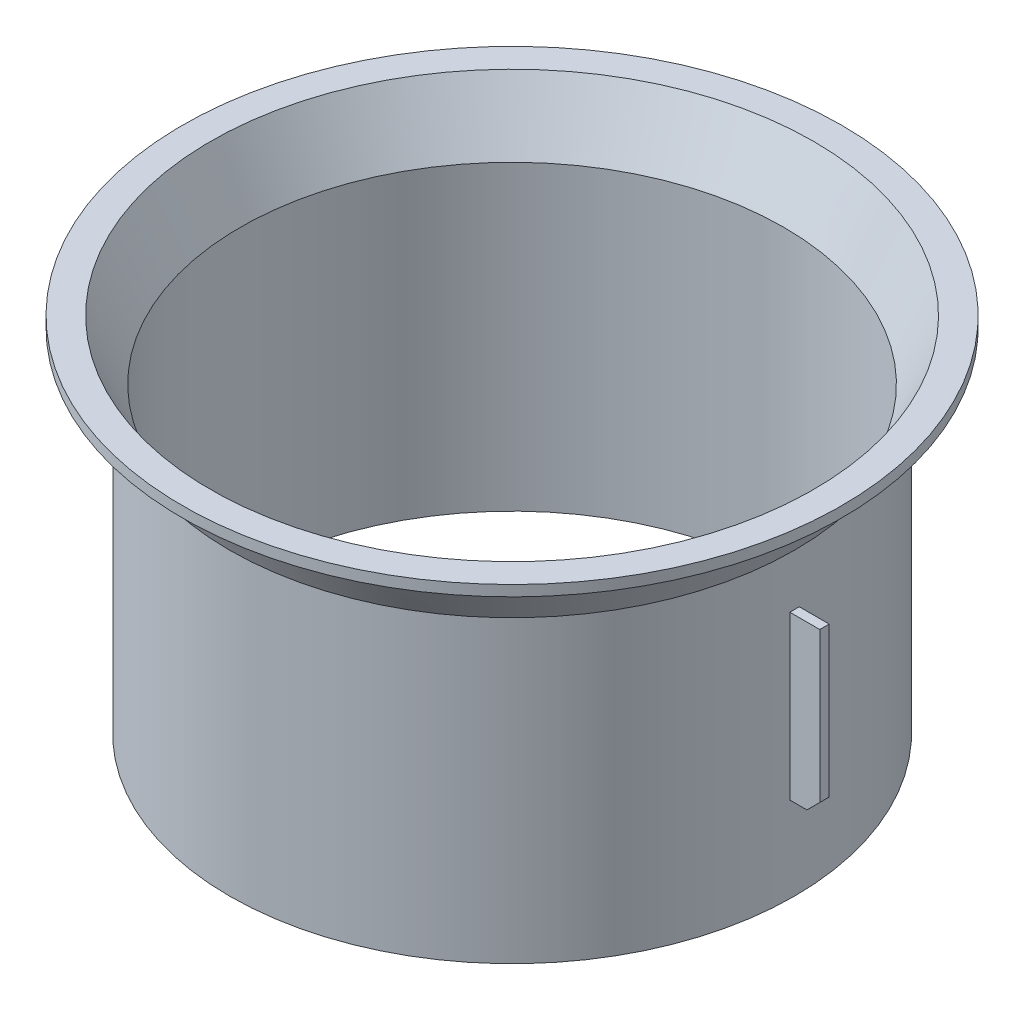
ISO-10303-21;
HEADER;
FILE_DESCRIPTION(('STEP AP214'),'2;1');
FILE_NAME('part.step','',(''),(''),'','','');
FILE_SCHEMA(('AUTOMOTIVE_DESIGN { 1 0 10303 214 1 1 1 1 }'));
ENDSEC;
DATA;
#1=APPLICATION_CONTEXT('core data for automotive mechanical design processes');
#2=APPLICATION_PROTOCOL_DEFINITION('international standard','automotive_design',2000,#1);
#3=PRODUCT_CONTEXT('',#1,'mechanical');
#4=PRODUCT('Part','Part','',(#3));
#5=PRODUCT_RELATED_PRODUCT_CATEGORY('part','',(#4));
#6=PRODUCT_DEFINITION_FORMATION('','',#4);
#7=PRODUCT_DEFINITION_CONTEXT('part definition',#1,'design');
#8=PRODUCT_DEFINITION('design','',#6,#7);
#9=PRODUCT_DEFINITION_SHAPE('','',#8);
#10=(LENGTH_UNIT() NAMED_UNIT(*) SI_UNIT(.MILLI.,.METRE.));
#11=(NAMED_UNIT(*) PLANE_ANGLE_UNIT() SI_UNIT($,.RADIAN.));
#12=(NAMED_UNIT(*) SI_UNIT($,.STERADIAN.) SOLID_ANGLE_UNIT());
#13=UNCERTAINTY_MEASURE_WITH_UNIT(LENGTH_MEASURE(1.E-05),#10,'distance_accuracy_value','');
#14=(GEOMETRIC_REPRESENTATION_CONTEXT(3) GLOBAL_UNCERTAINTY_ASSIGNED_CONTEXT((#13)) GLOBAL_UNIT_ASSIGNED_CONTEXT((#10,
#11,#12)) REPRESENTATION_CONTEXT('',''));
#15=CARTESIAN_POINT('',(0.,0.,0.));
#16=DIRECTION('',(0.,0.,1.));
#17=DIRECTION('',(1.,0.,0.));
#18=AXIS2_PLACEMENT_3D('',#15,#16,#17);
#19=CARTESIAN_POINT('',(0.,0.,0.));
#20=DIRECTION('',(0.,-1.,0.));
#21=DIRECTION('',(0.,0.,-1.));
#22=AXIS2_PLACEMENT_3D('',#19,#20,#21);
#23=CYLINDRICAL_SURFACE('',#22,33.);
#24=CARTESIAN_POINT('',(0.,35.,0.));
#25=DIRECTION('',(0.,-1.,0.));
#26=DIRECTION('',(0.,0.,-1.));
#27=AXIS2_PLACEMENT_3D('',#24,#25,#26);
#28=CIRCLE('',#27,33.);
#29=CARTESIAN_POINT('',(0.,35.,-33.));
#30=VERTEX_POINT('',#29);
#31=EDGE_CURVE('E198',#30,#30,#28,.T.);
#32=ORIENTED_EDGE('',*,*,#31,.T.);
#33=EDGE_LOOP('',(#32));
#34=FACE_BOUND('',#33,.T.);
#35=CARTESIAN_POINT('',(0.,0.,0.));
#36=DIRECTION('',(0.,-1.,0.));
#37=DIRECTION('',(0.,0.,-1.));
#38=AXIS2_PLACEMENT_3D('',#35,#36,#37);
#39=CIRCLE('',#38,33.);
#40=CARTESIAN_POINT('',(0.,0.,-33.));
#41=VERTEX_POINT('',#40);
#42=EDGE_CURVE('E201',#41,#41,#39,.T.);
#43=ORIENTED_EDGE('',*,*,#42,.F.);
#44=EDGE_LOOP('',(#43));
#45=FACE_BOUND('',#44,.T.);
#46=DIRECTION('',(0.,-1.,0.));
#47=VECTOR('',#46,1.);
#48=CARTESIAN_POINT('',(-32.9954163483354,29.,-0.550000000000006));
#49=LINE('',#48,#47);
#50=CARTESIAN_POINT('',(-32.9954163483354,29.,-0.550000000000006));
#51=VERTEX_POINT('',#50);
#52=CARTESIAN_POINT('',(-32.9954163483354,10.,-0.550000000000012));
#53=VERTEX_POINT('',#52);
#54=EDGE_CURVE('E172',#51,#53,#49,.T.);
#55=ORIENTED_EDGE('',*,*,#54,.F.);
#56=CARTESIAN_POINT('',(0.,29.,0.));
#57=DIRECTION('',(0.,-1.,0.));
#58=DIRECTION('',(0.,0.,-1.));
#59=AXIS2_PLACEMENT_3D('',#56,#57,#58);
#60=CIRCLE('',#59,33.);
#61=CARTESIAN_POINT('',(-32.9954163483354,29.,0.549999999999994));
#62=VERTEX_POINT('',#61);
#63=EDGE_CURVE('E207',#51,#62,#60,.F.);
#64=ORIENTED_EDGE('',*,*,#63,.T.);
#65=DIRECTION('',(0.,-1.,0.));
#66=VECTOR('',#65,1.);
#67=CARTESIAN_POINT('',(-32.9954163483354,29.,0.549999999999994));
#68=LINE('',#67,#66);
#69=CARTESIAN_POINT('',(-32.9954163483354,10.,0.549999999999994));
#70=VERTEX_POINT('',#69);
#71=EDGE_CURVE('E168',#62,#70,#68,.T.);
#72=ORIENTED_EDGE('',*,*,#71,.T.);
#73=CARTESIAN_POINT('',(0.,10.,0.));
#74=DIRECTION('',(0.,-1.,0.));
#75=DIRECTION('',(0.,0.,-1.));
#76=AXIS2_PLACEMENT_3D('',#73,#74,#75);
#77=CIRCLE('',#76,33.);
#78=EDGE_CURVE('E204',#53,#70,#77,.F.);
#79=ORIENTED_EDGE('',*,*,#78,.F.);
#80=EDGE_LOOP('',(#55,#64,#72,#79));
#81=FACE_BOUND('',#80,.T.);
#82=DIRECTION('',(0.,-1.,0.));
#83=VECTOR('',#82,1.);
#84=CARTESIAN_POINT('',(32.9954163483354,29.,0.549999999999994));
#85=LINE('',#84,#83);
#86=CARTESIAN_POINT('',(32.9954163483354,29.,0.549999999999994));
#87=VERTEX_POINT('',#86);
#88=CARTESIAN_POINT('',(32.9954163483354,10.,0.549999999999995));
#89=VERTEX_POINT('',#88);
#90=EDGE_CURVE('E152',#87,#89,#85,.T.);
#91=ORIENTED_EDGE('',*,*,#90,.F.);
#92=CARTESIAN_POINT('',(0.,29.,0.));
#93=DIRECTION('',(0.,-1.,0.));
#94=DIRECTION('',(0.,0.,-1.));
#95=AXIS2_PLACEMENT_3D('',#92,#93,#94);
#96=CIRCLE('',#95,33.);
#97=CARTESIAN_POINT('',(32.9954163483354,29.,-0.550000000000006));
#98=VERTEX_POINT('',#97);
#99=EDGE_CURVE('E212',#87,#98,#96,.F.);
#100=ORIENTED_EDGE('',*,*,#99,.T.);
#101=DIRECTION('',(0.,-1.,0.));
#102=VECTOR('',#101,1.);
#103=CARTESIAN_POINT('',(32.9954163483354,29.,-0.550000000000006));
#104=LINE('',#103,#102);
#105=CARTESIAN_POINT('',(32.9954163483354,10.,-0.550000000000006));
#106=VERTEX_POINT('',#105);
#107=EDGE_CURVE('E130',#98,#106,#104,.T.);
#108=ORIENTED_EDGE('',*,*,#107,.T.);
#109=CARTESIAN_POINT('',(0.,10.,0.));
#110=DIRECTION('',(0.,-1.,0.));
#111=DIRECTION('',(0.,0.,-1.));
#112=AXIS2_PLACEMENT_3D('',#109,#110,#111);
#113=CIRCLE('',#112,33.);
#114=EDGE_CURVE('E209',#89,#106,#113,.F.);
#115=ORIENTED_EDGE('',*,*,#114,.F.);
#116=EDGE_LOOP('',(#91,#100,#108,#115));
#117=FACE_BOUND('',#116,.T.);
#118=ADVANCED_FACE('F44',(#34,#45,#81,#117),#23,.T.);
#119=CARTESIAN_POINT('',(31.75,0.,0.));
#120=DIRECTION('',(0.,-1.,0.));
#121=DIRECTION('',(0.,0.,-1.));
#122=AXIS2_PLACEMENT_3D('',#119,#120,#121);
#123=PLANE('',#122);
#124=ORIENTED_EDGE('',*,*,#42,.T.);
#125=EDGE_LOOP('',(#124));
#126=FACE_BOUND('',#125,.T.);
#127=CARTESIAN_POINT('',(0.,0.,0.));
#128=DIRECTION('',(0.,-1.,0.));
#129=DIRECTION('',(0.,0.,-1.));
#130=AXIS2_PLACEMENT_3D('',#127,#128,#129);
#131=CIRCLE('',#130,31.75);
#132=CARTESIAN_POINT('',(0.,0.,-31.75));
#133=VERTEX_POINT('',#132);
#134=EDGE_CURVE('E175',#133,#133,#131,.T.);
#135=ORIENTED_EDGE('',*,*,#134,.F.);
#136=EDGE_LOOP('',(#135));
#137=FACE_BOUND('',#136,.T.);
#138=ADVANCED_FACE('F252',(#126,#137),#123,.T.);
#139=CARTESIAN_POINT('',(0.,35.,0.));
#140=DIRECTION('',(0.,1.,0.));
#141=DIRECTION('',(0.,0.,1.));
#142=AXIS2_PLACEMENT_3D('',#139,#140,#141);
#143=CONICAL_SURFACE('',#142,33.,0.463647609000805);
#144=CARTESIAN_POINT('',(0.,41.,0.));
#145=DIRECTION('',(0.,-1.,0.));
#146=DIRECTION('',(0.,0.,-1.));
#147=AXIS2_PLACEMENT_3D('',#144,#145,#146);
#148=CIRCLE('',#147,36.);
#149=CARTESIAN_POINT('',(0.,41.,-36.));
#150=VERTEX_POINT('',#149);
#151=EDGE_CURVE('E195',#150,#150,#148,.T.);
#152=ORIENTED_EDGE('',*,*,#151,.T.);
#153=EDGE_LOOP('',(#152));
#154=FACE_BOUND('',#153,.T.);
#155=ORIENTED_EDGE('',*,*,#31,.F.);
#156=EDGE_LOOP('',(#155));
#157=FACE_BOUND('',#156,.T.);
#158=ADVANCED_FACE('F258',(#154,#157),#143,.T.);
#159=CARTESIAN_POINT('',(36.,41.,0.));
#160=DIRECTION('',(0.,-1.,0.));
#161=DIRECTION('',(0.,0.,-1.));
#162=AXIS2_PLACEMENT_3D('',#159,#160,#161);
#163=PLANE('',#162);
#164=CARTESIAN_POINT('',(0.,41.,0.));
#165=DIRECTION('',(0.,-1.,0.));
#166=DIRECTION('',(0.,0.,-1.));
#167=AXIS2_PLACEMENT_3D('',#164,#165,#166);
#168=CIRCLE('',#167,38.5);
#169=CARTESIAN_POINT('',(0.,41.,-38.5));
#170=VERTEX_POINT('',#169);
#171=EDGE_CURVE('E192',#170,#170,#168,.T.);
#172=ORIENTED_EDGE('',*,*,#171,.T.);
#173=EDGE_LOOP('',(#172));
#174=FACE_BOUND('',#173,.T.);
#175=ORIENTED_EDGE('',*,*,#151,.F.);
#176=EDGE_LOOP('',(#175));
#177=FACE_BOUND('',#176,.T.);
#178=ADVANCED_FACE('F265',(#174,#177),#163,.T.);
#179=CARTESIAN_POINT('',(0.,0.,0.));
#180=DIRECTION('',(0.,-1.,0.));
#181=DIRECTION('',(0.,0.,-1.));
#182=AXIS2_PLACEMENT_3D('',#179,#180,#181);
#183=CYLINDRICAL_SURFACE('',#182,38.5);
#184=CARTESIAN_POINT('',(0.,42.25,0.));
#185=DIRECTION('',(0.,-1.,0.));
#186=DIRECTION('',(0.,0.,-1.));
#187=AXIS2_PLACEMENT_3D('',#184,#185,#186);
#188=CIRCLE('',#187,38.5);
#189=CARTESIAN_POINT('',(0.,42.25,-38.5));
#190=VERTEX_POINT('',#189);
#191=EDGE_CURVE('E189',#190,#190,#188,.T.);
#192=ORIENTED_EDGE('',*,*,#191,.T.);
#193=EDGE_LOOP('',(#192));
#194=FACE_BOUND('',#193,.T.);
#195=ORIENTED_EDGE('',*,*,#171,.F.);
#196=EDGE_LOOP('',(#195));
#197=FACE_BOUND('',#196,.T.);
#198=ADVANCED_FACE('F269',(#194,#197),#183,.T.);
#199=CARTESIAN_POINT('',(38.5,42.25,0.));
#200=DIRECTION('',(0.,1.,0.));
#201=DIRECTION('',(0.,0.,1.));
#202=AXIS2_PLACEMENT_3D('',#199,#200,#201);
#203=PLANE('',#202);
#204=CARTESIAN_POINT('',(0.,42.25,0.));
#205=DIRECTION('',(0.,-1.,0.));
#206=DIRECTION('',(0.,0.,-1.));
#207=AXIS2_PLACEMENT_3D('',#204,#205,#206);
#208=CIRCLE('',#207,35.2274575140626);
#209=CARTESIAN_POINT('',(0.,42.25,-35.2274575140626));
#210=VERTEX_POINT('',#209);
#211=EDGE_CURVE('E186',#210,#210,#208,.T.);
#212=ORIENTED_EDGE('',*,*,#211,.T.);
#213=EDGE_LOOP('',(#212));
#214=FACE_BOUND('',#213,.T.);
#215=ORIENTED_EDGE('',*,*,#191,.F.);
#216=EDGE_LOOP('',(#215));
#217=FACE_BOUND('',#216,.T.);
#218=ADVANCED_FACE('F273',(#214,#217),#203,.T.);
#219=CARTESIAN_POINT('',(0.,42.25,0.));
#220=DIRECTION('',(0.,1.,0.));
#221=DIRECTION('',(0.,0.,1.));
#222=AXIS2_PLACEMENT_3D('',#219,#220,#221);
#223=CONICAL_SURFACE('',#222,35.2274575140626,0.463647609000805);
#224=CARTESIAN_POINT('',(0.,35.2950849718747,0.));
#225=DIRECTION('',(0.,-1.,0.));
#226=DIRECTION('',(0.,0.,-1.));
#227=AXIS2_PLACEMENT_3D('',#224,#225,#226);
#228=CIRCLE('',#227,31.75);
#229=CARTESIAN_POINT('',(0.,35.2950849718747,-31.75));
#230=VERTEX_POINT('',#229);
#231=EDGE_CURVE('E183',#230,#230,#228,.T.);
#232=ORIENTED_EDGE('',*,*,#231,.T.);
#233=EDGE_LOOP('',(#232));
#234=FACE_BOUND('',#233,.T.);
#235=ORIENTED_EDGE('',*,*,#211,.F.);
#236=EDGE_LOOP('',(#235));
#237=FACE_BOUND('',#236,.T.);
#238=ADVANCED_FACE('F277',(#234,#237),#223,.F.);
#239=CARTESIAN_POINT('',(0.,0.,0.));
#240=DIRECTION('',(0.,-1.,0.));
#241=DIRECTION('',(0.,0.,-1.));
#242=AXIS2_PLACEMENT_3D('',#239,#240,#241);
#243=CYLINDRICAL_SURFACE('',#242,31.75);
#244=ORIENTED_EDGE('',*,*,#134,.T.);
#245=EDGE_LOOP('',(#244));
#246=FACE_BOUND('',#245,.T.);
#247=ORIENTED_EDGE('',*,*,#231,.F.);
#248=EDGE_LOOP('',(#247));
#249=FACE_BOUND('',#248,.T.);
#250=ADVANCED_FACE('F281',(#246,#249),#243,.F.);
#251=CARTESIAN_POINT('',(-32.9954163483354,29.,-0.550000000000006));
#252=DIRECTION('',(0.,0.,-1.));
#253=DIRECTION('',(-1.,0.,0.));
#254=AXIS2_PLACEMENT_3D('',#251,#252,#253);
#255=PLANE('',#254);
#256=DIRECTION('',(1.,0.,0.));
#257=VECTOR('',#256,1.);
#258=CARTESIAN_POINT('',(-32.9954163483354,10.,-0.550000000000006));
#259=LINE('',#258,#257);
#260=CARTESIAN_POINT('',(-34.9954163483354,10.,-0.550000000000005));
#261=VERTEX_POINT('',#260);
#262=EDGE_CURVE('E162',#261,#53,#259,.T.);
#263=ORIENTED_EDGE('',*,*,#262,.F.);
#264=DIRECTION('',(0.707106781186544,-0.707106781186551,0.));
#265=VECTOR('',#264,1.);
#266=CARTESIAN_POINT('',(-43.4954163483354,18.5000000000001,-0.550000000000002));
#267=LINE('',#266,#265);
#268=CARTESIAN_POINT('',(-36.4954163483354,11.5,-0.550000000000005));
#269=VERTEX_POINT('',#268);
#270=EDGE_CURVE('E66',#261,#269,#267,.F.);
#271=ORIENTED_EDGE('',*,*,#270,.T.);
#272=DIRECTION('',(0.,-1.,0.));
#273=VECTOR('',#272,1.);
#274=CARTESIAN_POINT('',(-36.4954163483354,29.,-0.550000000000005));
#275=LINE('',#274,#273);
#276=CARTESIAN_POINT('',(-36.4954163483354,29.,-0.550000000000005));
#277=VERTEX_POINT('',#276);
#278=EDGE_CURVE('E176',#277,#269,#275,.T.);
#279=ORIENTED_EDGE('',*,*,#278,.F.);
#280=DIRECTION('',(1.,0.,0.));
#281=VECTOR('',#280,1.);
#282=CARTESIAN_POINT('',(-32.9954163483354,29.,-0.550000000000006));
#283=LINE('',#282,#281);
#284=EDGE_CURVE('E165',#277,#51,#283,.T.);
#285=ORIENTED_EDGE('',*,*,#284,.T.);
#286=ORIENTED_EDGE('',*,*,#54,.T.);
#287=EDGE_LOOP('',(#263,#271,#279,#285,#286));
#288=FACE_BOUND('',#287,.T.);
#289=ADVANCED_FACE('F232',(#288),#255,.T.);
#290=CARTESIAN_POINT('',(-36.4954163483354,29.,-0.550000000000005));
#291=DIRECTION('',(-1.,0.,0.));
#292=DIRECTION('',(0.,0.,1.));
#293=AXIS2_PLACEMENT_3D('',#290,#291,#292);
#294=PLANE('',#293);
#295=ORIENTED_EDGE('',*,*,#278,.T.);
#296=DIRECTION('',(0.,0.,1.));
#297=VECTOR('',#296,1.);
#298=CARTESIAN_POINT('',(-36.4954163483354,11.5,-0.550000000000005));
#299=LINE('',#298,#297);
#300=CARTESIAN_POINT('',(-36.4954163483354,11.5,0.549999999999995));
#301=VERTEX_POINT('',#300);
#302=EDGE_CURVE('E52',#269,#301,#299,.T.);
#303=ORIENTED_EDGE('',*,*,#302,.T.);
#304=DIRECTION('',(0.,-1.,0.));
#305=VECTOR('',#304,1.);
#306=CARTESIAN_POINT('',(-36.4954163483354,29.,0.549999999999995));
#307=LINE('',#306,#305);
#308=CARTESIAN_POINT('',(-36.4954163483354,29.,0.549999999999995));
#309=VERTEX_POINT('',#308);
#310=EDGE_CURVE('E178',#309,#301,#307,.T.);
#311=ORIENTED_EDGE('',*,*,#310,.F.);
#312=DIRECTION('',(0.,0.,-1.));
#313=VECTOR('',#312,1.);
#314=CARTESIAN_POINT('',(-36.4954163483354,29.,-0.550000000000005));
#315=LINE('',#314,#313);
#316=EDGE_CURVE('E161',#309,#277,#315,.T.);
#317=ORIENTED_EDGE('',*,*,#316,.T.);
#318=EDGE_LOOP('',(#295,#303,#311,#317));
#319=FACE_BOUND('',#318,.T.);
#320=ADVANCED_FACE('F288',(#319),#294,.T.);
#321=CARTESIAN_POINT('',(-32.9954163483354,29.,0.549999999999994));
#322=DIRECTION('',(0.,0.,1.));
#323=DIRECTION('',(1.,0.,0.));
#324=AXIS2_PLACEMENT_3D('',#321,#322,#323);
#325=PLANE('',#324);
#326=ORIENTED_EDGE('',*,*,#310,.T.);
#327=DIRECTION('',(-0.707106781186544,0.707106781186551,0.));
#328=VECTOR('',#327,1.);
#329=CARTESIAN_POINT('',(-43.4954163483354,18.5000000000001,0.549999999999998));
#330=LINE('',#329,#328);
#331=CARTESIAN_POINT('',(-34.9954163483354,10.,0.549999999999995));
#332=VERTEX_POINT('',#331);
#333=EDGE_CURVE('E13',#301,#332,#330,.F.);
#334=ORIENTED_EDGE('',*,*,#333,.T.);
#335=DIRECTION('',(-1.,0.,0.));
#336=VECTOR('',#335,1.);
#337=CARTESIAN_POINT('',(-32.9954163483354,10.,0.549999999999994));
#338=LINE('',#337,#336);
#339=EDGE_CURVE('E155',#70,#332,#338,.T.);
#340=ORIENTED_EDGE('',*,*,#339,.F.);
#341=ORIENTED_EDGE('',*,*,#71,.F.);
#342=DIRECTION('',(-1.,0.,0.));
#343=VECTOR('',#342,1.);
#344=CARTESIAN_POINT('',(-32.9954163483354,29.,0.549999999999994));
#345=LINE('',#344,#343);
#346=EDGE_CURVE('E158',#62,#309,#345,.T.);
#347=ORIENTED_EDGE('',*,*,#346,.T.);
#348=EDGE_LOOP('',(#326,#334,#340,#341,#347));
#349=FACE_BOUND('',#348,.T.);
#350=ADVANCED_FACE('F243',(#349),#325,.T.);
#351=CARTESIAN_POINT('',(0.,29.,0.));
#352=DIRECTION('',(0.,-1.,0.));
#353=DIRECTION('',(0.,0.,-1.));
#354=AXIS2_PLACEMENT_3D('',#351,#352,#353);
#355=PLANE('',#354);
#356=ORIENTED_EDGE('',*,*,#63,.F.);
#357=ORIENTED_EDGE('',*,*,#284,.F.);
#358=ORIENTED_EDGE('',*,*,#316,.F.);
#359=ORIENTED_EDGE('',*,*,#346,.F.);
#360=EDGE_LOOP('',(#356,#357,#358,#359));
#361=FACE_BOUND('',#360,.T.);
#362=ADVANCED_FACE('F240',(#361),#355,.F.);
#363=CARTESIAN_POINT('',(0.,10.,0.));
#364=DIRECTION('',(0.,-1.,0.));
#365=DIRECTION('',(0.,0.,-1.));
#366=AXIS2_PLACEMENT_3D('',#363,#364,#365);
#367=PLANE('',#366);
#368=ORIENTED_EDGE('',*,*,#339,.T.);
#369=DIRECTION('',(0.,0.,-1.));
#370=VECTOR('',#369,1.);
#371=CARTESIAN_POINT('',(-34.9954163483354,10.,0.));
#372=LINE('',#371,#370);
#373=EDGE_CURVE('E222',#332,#261,#372,.T.);
#374=ORIENTED_EDGE('',*,*,#373,.T.);
#375=ORIENTED_EDGE('',*,*,#262,.T.);
#376=ORIENTED_EDGE('',*,*,#78,.T.);
#377=EDGE_LOOP('',(#368,#374,#375,#376));
#378=FACE_BOUND('',#377,.T.);
#379=ADVANCED_FACE('F227',(#378),#367,.T.);
#380=CARTESIAN_POINT('',(32.9954163483354,29.,0.549999999999994));
#381=DIRECTION('',(0.,0.,1.));
#382=DIRECTION('',(1.,0.,0.));
#383=AXIS2_PLACEMENT_3D('',#380,#381,#382);
#384=PLANE('',#383);
#385=DIRECTION('',(-1.,0.,0.));
#386=VECTOR('',#385,1.);
#387=CARTESIAN_POINT('',(32.9954163483354,10.,0.549999999999994));
#388=LINE('',#387,#386);
#389=CARTESIAN_POINT('',(34.9954163483354,10.,0.549999999999995));
#390=VERTEX_POINT('',#389);
#391=EDGE_CURVE('E144',#390,#89,#388,.T.);
#392=ORIENTED_EDGE('',*,*,#391,.F.);
#393=DIRECTION('',(-0.707106781186544,-0.707106781186551,0.));
#394=VECTOR('',#393,1.);
#395=CARTESIAN_POINT('',(43.4954163483354,18.5000000000001,0.549999999999998));
#396=LINE('',#395,#394);
#397=CARTESIAN_POINT('',(36.4954163483354,11.5,0.549999999999995));
#398=VERTEX_POINT('',#397);
#399=EDGE_CURVE('E217',#390,#398,#396,.F.);
#400=ORIENTED_EDGE('',*,*,#399,.T.);
#401=DIRECTION('',(0.,-1.,0.));
#402=VECTOR('',#401,1.);
#403=CARTESIAN_POINT('',(36.4954163483354,29.,0.549999999999995));
#404=LINE('',#403,#402);
#405=CARTESIAN_POINT('',(36.4954163483354,29.,0.549999999999995));
#406=VERTEX_POINT('',#405);
#407=EDGE_CURVE('E129',#406,#398,#404,.T.);
#408=ORIENTED_EDGE('',*,*,#407,.F.);
#409=DIRECTION('',(-1.,0.,0.));
#410=VECTOR('',#409,1.);
#411=CARTESIAN_POINT('',(32.9954163483354,29.,0.549999999999994));
#412=LINE('',#411,#410);
#413=EDGE_CURVE('E139',#406,#87,#412,.T.);
#414=ORIENTED_EDGE('',*,*,#413,.T.);
#415=ORIENTED_EDGE('',*,*,#90,.T.);
#416=EDGE_LOOP('',(#392,#400,#408,#414,#415));
#417=FACE_BOUND('',#416,.T.);
#418=ADVANCED_FACE('F295',(#417),#384,.T.);
#419=CARTESIAN_POINT('',(36.4954163483354,29.,-0.550000000000005));
#420=DIRECTION('',(1.,0.,0.));
#421=DIRECTION('',(0.,0.,-1.));
#422=AXIS2_PLACEMENT_3D('',#419,#420,#421);
#423=PLANE('',#422);
#424=ORIENTED_EDGE('',*,*,#407,.T.);
#425=DIRECTION('',(0.,0.,-1.));
#426=VECTOR('',#425,1.);
#427=CARTESIAN_POINT('',(36.4954163483354,11.5,-0.550000000000005));
#428=LINE('',#427,#426);
#429=CARTESIAN_POINT('',(36.4954163483354,11.5,-0.550000000000005));
#430=VERTEX_POINT('',#429);
#431=EDGE_CURVE('E125',#398,#430,#428,.T.);
#432=ORIENTED_EDGE('',*,*,#431,.T.);
#433=DIRECTION('',(0.,-1.,0.));
#434=VECTOR('',#433,1.);
#435=CARTESIAN_POINT('',(36.4954163483354,29.,-0.550000000000005));
#436=LINE('',#435,#434);
#437=CARTESIAN_POINT('',(36.4954163483354,29.,-0.550000000000005));
#438=VERTEX_POINT('',#437);
#439=EDGE_CURVE('E119',#438,#430,#436,.T.);
#440=ORIENTED_EDGE('',*,*,#439,.F.);
#441=DIRECTION('',(0.,0.,1.));
#442=VECTOR('',#441,1.);
#443=CARTESIAN_POINT('',(36.4954163483354,29.,-0.550000000000005));
#444=LINE('',#443,#442);
#445=EDGE_CURVE('E123',#438,#406,#444,.T.);
#446=ORIENTED_EDGE('',*,*,#445,.T.);
#447=EDGE_LOOP('',(#424,#432,#440,#446));
#448=FACE_BOUND('',#447,.T.);
#449=ADVANCED_FACE('F122',(#448),#423,.T.);
#450=CARTESIAN_POINT('',(32.9954163483354,29.,-0.550000000000006));
#451=DIRECTION('',(0.,0.,-1.));
#452=DIRECTION('',(-1.,0.,0.));
#453=AXIS2_PLACEMENT_3D('',#450,#451,#452);
#454=PLANE('',#453);
#455=ORIENTED_EDGE('',*,*,#439,.T.);
#456=DIRECTION('',(0.707106781186544,0.707106781186551,0.));
#457=VECTOR('',#456,1.);
#458=CARTESIAN_POINT('',(43.4954163483354,18.5000000000001,-0.550000000000002));
#459=LINE('',#458,#457);
#460=CARTESIAN_POINT('',(34.9954163483354,10.,-0.550000000000005));
#461=VERTEX_POINT('',#460);
#462=EDGE_CURVE('E220',#430,#461,#459,.F.);
#463=ORIENTED_EDGE('',*,*,#462,.T.);
#464=DIRECTION('',(1.,0.,0.));
#465=VECTOR('',#464,1.);
#466=CARTESIAN_POINT('',(32.9954163483354,10.,-0.550000000000006));
#467=LINE('',#466,#465);
#468=EDGE_CURVE('E146',#106,#461,#467,.T.);
#469=ORIENTED_EDGE('',*,*,#468,.F.);
#470=ORIENTED_EDGE('',*,*,#107,.F.);
#471=DIRECTION('',(1.,0.,0.));
#472=VECTOR('',#471,1.);
#473=CARTESIAN_POINT('',(32.9954163483354,29.,-0.550000000000006));
#474=LINE('',#473,#472);
#475=EDGE_CURVE('E137',#98,#438,#474,.T.);
#476=ORIENTED_EDGE('',*,*,#475,.T.);
#477=EDGE_LOOP('',(#455,#463,#469,#470,#476));
#478=FACE_BOUND('',#477,.T.);
#479=ADVANCED_FACE('F142',(#478),#454,.T.);
#480=CARTESIAN_POINT('',(0.,29.,0.));
#481=DIRECTION('',(0.,-1.,0.));
#482=DIRECTION('',(0.,0.,-1.));
#483=AXIS2_PLACEMENT_3D('',#480,#481,#482);
#484=PLANE('',#483);
#485=ORIENTED_EDGE('',*,*,#99,.F.);
#486=ORIENTED_EDGE('',*,*,#413,.F.);
#487=ORIENTED_EDGE('',*,*,#445,.F.);
#488=ORIENTED_EDGE('',*,*,#475,.F.);
#489=EDGE_LOOP('',(#485,#486,#487,#488));
#490=FACE_BOUND('',#489,.T.);
#491=ADVANCED_FACE('F136',(#490),#484,.F.);
#492=CARTESIAN_POINT('',(0.,10.,0.));
#493=DIRECTION('',(0.,-1.,0.));
#494=DIRECTION('',(0.,0.,-1.));
#495=AXIS2_PLACEMENT_3D('',#492,#493,#494);
#496=PLANE('',#495);
#497=ORIENTED_EDGE('',*,*,#468,.T.);
#498=DIRECTION('',(0.,0.,1.));
#499=VECTOR('',#498,1.);
#500=CARTESIAN_POINT('',(34.9954163483354,10.,0.));
#501=LINE('',#500,#499);
#502=EDGE_CURVE('E214',#461,#390,#501,.T.);
#503=ORIENTED_EDGE('',*,*,#502,.T.);
#504=ORIENTED_EDGE('',*,*,#391,.T.);
#505=ORIENTED_EDGE('',*,*,#114,.T.);
#506=EDGE_LOOP('',(#497,#503,#504,#505));
#507=FACE_BOUND('',#506,.T.);
#508=ADVANCED_FACE('F249',(#507),#496,.T.);
#509=CARTESIAN_POINT('',(34.9954163483354,10.,0.));
#510=DIRECTION('',(-0.707106781186551,0.707106781186544,0.));
#511=DIRECTION('',(0.,0.,1.));
#512=AXIS2_PLACEMENT_3D('',#509,#510,#511);
#513=PLANE('',#512);
#514=ORIENTED_EDGE('',*,*,#462,.F.);
#515=ORIENTED_EDGE('',*,*,#431,.F.);
#516=ORIENTED_EDGE('',*,*,#399,.F.);
#517=ORIENTED_EDGE('',*,*,#502,.F.);
#518=EDGE_LOOP('',(#514,#515,#516,#517));
#519=FACE_BOUND('',#518,.T.);
#520=ADVANCED_FACE('F245',(#519),#513,.F.);
#521=CARTESIAN_POINT('',(-34.9954163483354,10.,0.));
#522=DIRECTION('',(0.707106781186551,0.707106781186544,0.));
#523=DIRECTION('',(0.,0.,-1.));
#524=AXIS2_PLACEMENT_3D('',#521,#522,#523);
#525=PLANE('',#524);
#526=ORIENTED_EDGE('',*,*,#333,.F.);
#527=ORIENTED_EDGE('',*,*,#302,.F.);
#528=ORIENTED_EDGE('',*,*,#270,.F.);
#529=ORIENTED_EDGE('',*,*,#373,.F.);
#530=EDGE_LOOP('',(#526,#527,#528,#529));
#531=FACE_BOUND('',#530,.T.);
#532=ADVANCED_FACE('F46',(#531),#525,.F.);
#533=CLOSED_SHELL('',(#118,#138,#158,#178,#198,#218,#238,#250,#289,#320,#350,#362,#379,#418,
#449,#479,#491,#508,#520,#532));
#534=MANIFOLD_SOLID_BREP('B2',#533);
#535=ADVANCED_BREP_SHAPE_REPRESENTATION('',(#18,#534),#14);
#536=SHAPE_DEFINITION_REPRESENTATION(#9,#535);
ENDSEC;
END-ISO-10303-21;
